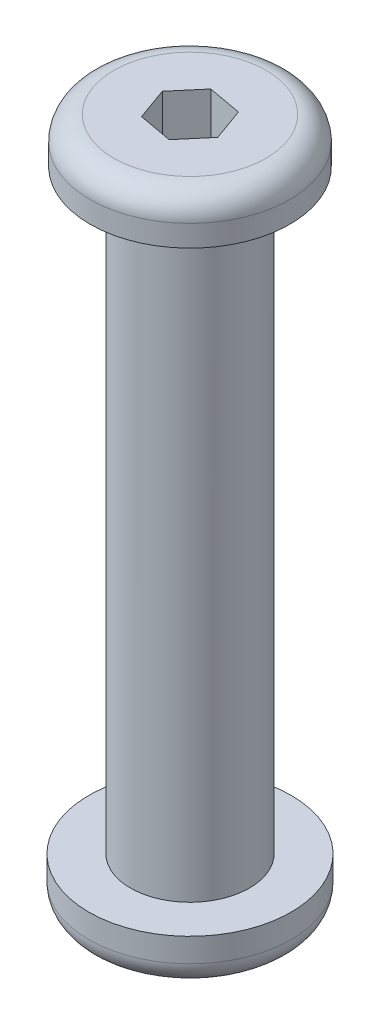
ISO-10303-21;
HEADER;
FILE_DESCRIPTION(('STEP AP214'),'2;1');
FILE_NAME('part.step','',(''),(''),'','','');
FILE_SCHEMA(('AUTOMOTIVE_DESIGN { 1 0 10303 214 1 1 1 1 }'));
ENDSEC;
DATA;
#1=APPLICATION_CONTEXT('core data for automotive mechanical design processes');
#2=APPLICATION_PROTOCOL_DEFINITION('international standard','automotive_design',2000,#1);
#3=PRODUCT_CONTEXT('',#1,'mechanical');
#4=PRODUCT('Part','Part','',(#3));
#5=PRODUCT_RELATED_PRODUCT_CATEGORY('part','',(#4));
#6=PRODUCT_DEFINITION_FORMATION('','',#4);
#7=PRODUCT_DEFINITION_CONTEXT('part definition',#1,'design');
#8=PRODUCT_DEFINITION('design','',#6,#7);
#9=PRODUCT_DEFINITION_SHAPE('','',#8);
#10=(LENGTH_UNIT() NAMED_UNIT(*) SI_UNIT(.MILLI.,.METRE.));
#11=(NAMED_UNIT(*) PLANE_ANGLE_UNIT() SI_UNIT($,.RADIAN.));
#12=(NAMED_UNIT(*) SI_UNIT($,.STERADIAN.) SOLID_ANGLE_UNIT());
#13=UNCERTAINTY_MEASURE_WITH_UNIT(LENGTH_MEASURE(1.E-05),#10,'distance_accuracy_value','');
#14=(GEOMETRIC_REPRESENTATION_CONTEXT(3) GLOBAL_UNCERTAINTY_ASSIGNED_CONTEXT((#13)) GLOBAL_UNIT_ASSIGNED_CONTEXT((#10,
#11,#12)) REPRESENTATION_CONTEXT('',''));
#15=CARTESIAN_POINT('',(0.,0.,0.));
#16=DIRECTION('',(0.,0.,1.));
#17=DIRECTION('',(1.,0.,0.));
#18=AXIS2_PLACEMENT_3D('',#15,#16,#17);
#19=CARTESIAN_POINT('',(0.,25.,0.));
#20=DIRECTION('',(0.,-1.,0.));
#21=DIRECTION('',(0.,0.,-1.));
#22=AXIS2_PLACEMENT_3D('',#19,#20,#21);
#23=CYLINDRICAL_SURFACE('',#22,2.5);
#24=CARTESIAN_POINT('',(0.,25.,0.));
#25=DIRECTION('',(0.,1.,0.));
#26=DIRECTION('',(0.,0.,1.));
#27=AXIS2_PLACEMENT_3D('',#24,#25,#26);
#28=CIRCLE('',#27,2.5);
#29=CARTESIAN_POINT('',(0.,25.,2.5));
#30=VERTEX_POINT('',#29);
#31=EDGE_CURVE('E236',#30,#30,#28,.T.);
#32=ORIENTED_EDGE('',*,*,#31,.F.);
#33=EDGE_LOOP('',(#32));
#34=FACE_BOUND('',#33,.T.);
#35=CARTESIAN_POINT('',(0.,0.,0.));
#36=DIRECTION('',(0.,-1.,0.));
#37=DIRECTION('',(0.,0.,-1.));
#38=AXIS2_PLACEMENT_3D('',#35,#36,#37);
#39=CIRCLE('',#38,2.5);
#40=CARTESIAN_POINT('',(0.,0.,-2.5));
#41=VERTEX_POINT('',#40);
#42=EDGE_CURVE('E188',#41,#41,#39,.T.);
#43=ORIENTED_EDGE('',*,*,#42,.F.);
#44=EDGE_LOOP('',(#43));
#45=FACE_BOUND('',#44,.T.);
#46=ADVANCED_FACE('F41',(#34,#45),#23,.T.);
#47=CARTESIAN_POINT('',(0.,26.9,0.));
#48=DIRECTION('',(0.,1.,0.));
#49=DIRECTION('',(0.,0.,1.));
#50=AXIS2_PLACEMENT_3D('',#47,#48,#49);
#51=PLANE('',#50);
#52=CARTESIAN_POINT('',(0.,26.9,0.));
#53=DIRECTION('',(0.,1.,0.));
#54=DIRECTION('',(0.,0.,1.));
#55=AXIS2_PLACEMENT_3D('',#52,#53,#54);
#56=CIRCLE('',#55,3.2);
#57=CARTESIAN_POINT('',(0.,26.9,3.2));
#58=VERTEX_POINT('',#57);
#59=EDGE_CURVE('E239',#58,#58,#56,.T.);
#60=ORIENTED_EDGE('',*,*,#59,.T.);
#61=EDGE_LOOP('',(#60));
#62=FACE_BOUND('',#61,.T.);
#63=DIRECTION('',(-0.983890145469255,0.,-0.178774107880554));
#64=VECTOR('',#63,1.);
#65=CARTESIAN_POINT('',(0.933529185275309,26.9,-1.10084358270035));
#66=LINE('',#65,#64);
#67=CARTESIAN_POINT('',(0.933529185275309,26.9,-1.10084358270035));
#68=VERTEX_POINT('',#67);
#69=CARTESIAN_POINT('',(-0.486593915573927,26.9,-1.35888178097279));
#70=VERTEX_POINT('',#69);
#71=EDGE_CURVE('E193',#68,#70,#66,.T.);
#72=ORIENTED_EDGE('',*,*,#71,.F.);
#73=DIRECTION('',(-0.337122153771169,0.,-0.941460914449818));
#74=VECTOR('',#73,1.);
#75=CARTESIAN_POINT('',(1.42012310084924,26.9,0.258038198272432));
#76=LINE('',#75,#74);
#77=CARTESIAN_POINT('',(1.42012310084924,26.9,0.258038198272432));
#78=VERTEX_POINT('',#77);
#79=EDGE_CURVE('E191',#78,#68,#76,.T.);
#80=ORIENTED_EDGE('',*,*,#79,.F.);
#81=DIRECTION('',(0.646767991698087,0.,-0.762686806569265));
#82=VECTOR('',#81,1.);
#83=CARTESIAN_POINT('',(0.486593915573928,26.9,1.35888178097278));
#84=LINE('',#83,#82);
#85=CARTESIAN_POINT('',(0.486593915573928,26.9,1.35888178097278));
#86=VERTEX_POINT('',#85);
#87=EDGE_CURVE('E203',#86,#78,#84,.T.);
#88=ORIENTED_EDGE('',*,*,#87,.F.);
#89=DIRECTION('',(0.983890145469255,0.,0.178774107880553));
#90=VECTOR('',#89,1.);
#91=CARTESIAN_POINT('',(-0.933529185275311,26.9,1.10084358270035));
#92=LINE('',#91,#90);
#93=CARTESIAN_POINT('',(-0.933529185275311,26.9,1.10084358270035));
#94=VERTEX_POINT('',#93);
#95=EDGE_CURVE('E200',#94,#86,#92,.T.);
#96=ORIENTED_EDGE('',*,*,#95,.F.);
#97=DIRECTION('',(0.337122153771169,0.,0.941460914449818));
#98=VECTOR('',#97,1.);
#99=CARTESIAN_POINT('',(-1.42012310084924,26.9,-0.258038198272431));
#100=LINE('',#99,#98);
#101=CARTESIAN_POINT('',(-1.42012310084924,26.9,-0.258038198272431));
#102=VERTEX_POINT('',#101);
#103=EDGE_CURVE('E198',#102,#94,#100,.T.);
#104=ORIENTED_EDGE('',*,*,#103,.F.);
#105=DIRECTION('',(-0.646767991698087,0.,0.762686806569266));
#106=VECTOR('',#105,1.);
#107=CARTESIAN_POINT('',(-0.486593915573927,26.9,-1.35888178097279));
#108=LINE('',#107,#106);
#109=EDGE_CURVE('E196',#70,#102,#108,.T.);
#110=ORIENTED_EDGE('',*,*,#109,.F.);
#111=EDGE_LOOP('',(#72,#80,#88,#96,#104,#110));
#112=FACE_BOUND('',#111,.T.);
#113=ADVANCED_FACE('F258',(#62,#112),#51,.T.);
#114=CARTESIAN_POINT('',(0.,25.,0.));
#115=DIRECTION('',(0.,1.,0.));
#116=DIRECTION('',(0.,0.,1.));
#117=AXIS2_PLACEMENT_3D('',#114,#115,#116);
#118=PLANE('',#117);
#119=ORIENTED_EDGE('',*,*,#31,.T.);
#120=EDGE_LOOP('',(#119));
#121=FACE_BOUND('',#120,.T.);
#122=CARTESIAN_POINT('',(0.,25.,0.));
#123=DIRECTION('',(0.,1.,0.));
#124=DIRECTION('',(0.,0.,1.));
#125=AXIS2_PLACEMENT_3D('',#122,#123,#124);
#126=CIRCLE('',#125,4.2);
#127=CARTESIAN_POINT('',(0.,25.,-4.2));
#128=VERTEX_POINT('',#127);
#129=EDGE_CURVE('E233',#128,#128,#126,.T.);
#130=ORIENTED_EDGE('',*,*,#129,.F.);
#131=EDGE_LOOP('',(#130));
#132=FACE_BOUND('',#131,.T.);
#133=ADVANCED_FACE('F265',(#121,#132),#118,.F.);
#134=CARTESIAN_POINT('',(0.,26.9,0.));
#135=DIRECTION('',(0.,-1.,0.));
#136=DIRECTION('',(0.,0.,-1.));
#137=AXIS2_PLACEMENT_3D('',#134,#135,#136);
#138=CYLINDRICAL_SURFACE('',#137,4.2);
#139=CARTESIAN_POINT('',(0.,25.9,0.));
#140=DIRECTION('',(0.,1.,0.));
#141=DIRECTION('',(0.,0.,1.));
#142=AXIS2_PLACEMENT_3D('',#139,#140,#141);
#143=CIRCLE('',#142,4.2);
#144=CARTESIAN_POINT('',(0.,25.9,-4.2));
#145=VERTEX_POINT('',#144);
#146=EDGE_CURVE('E242',#145,#145,#143,.F.);
#147=CARTESIAN_POINT('',(0.,25.9,-4.2));
#148=CARTESIAN_POINT('',(0.,25.890625,-4.2));
#149=CARTESIAN_POINT('',(0.,25.88125,-4.2));
#150=CARTESIAN_POINT('',(0.,25.8625,-4.2));
#151=CARTESIAN_POINT('',(0.,25.853125,-4.2));
#152=CARTESIAN_POINT('',(0.,25.834375,-4.2));
#153=CARTESIAN_POINT('',(0.,25.825,-4.2));
#154=CARTESIAN_POINT('',(0.,25.80625,-4.2));
#155=CARTESIAN_POINT('',(0.,25.796875,-4.2));
#156=CARTESIAN_POINT('',(0.,25.778125,-4.2));
#157=CARTESIAN_POINT('',(0.,25.76875,-4.2));
#158=CARTESIAN_POINT('',(0.,25.75,-4.2));
#159=CARTESIAN_POINT('',(0.,25.740625,-4.2));
#160=CARTESIAN_POINT('',(0.,25.721875,-4.2));
#161=CARTESIAN_POINT('',(0.,25.7125,-4.2));
#162=CARTESIAN_POINT('',(0.,25.69375,-4.2));
#163=CARTESIAN_POINT('',(0.,25.684375,-4.2));
#164=CARTESIAN_POINT('',(0.,25.665625,-4.2));
#165=CARTESIAN_POINT('',(0.,25.65625,-4.2));
#166=CARTESIAN_POINT('',(0.,25.6375,-4.2));
#167=CARTESIAN_POINT('',(0.,25.628125,-4.2));
#168=CARTESIAN_POINT('',(0.,25.609375,-4.2));
#169=CARTESIAN_POINT('',(0.,25.6,-4.2));
#170=CARTESIAN_POINT('',(0.,25.58125,-4.2));
#171=CARTESIAN_POINT('',(0.,25.571875,-4.2));
#172=CARTESIAN_POINT('',(0.,25.553125,-4.2));
#173=CARTESIAN_POINT('',(0.,25.54375,-4.2));
#174=CARTESIAN_POINT('',(0.,25.525,-4.2));
#175=CARTESIAN_POINT('',(0.,25.515625,-4.2));
#176=CARTESIAN_POINT('',(0.,25.496875,-4.2));
#177=CARTESIAN_POINT('',(0.,25.4875,-4.2));
#178=CARTESIAN_POINT('',(0.,25.46875,-4.2));
#179=CARTESIAN_POINT('',(0.,25.459375,-4.2));
#180=CARTESIAN_POINT('',(0.,25.440625,-4.2));
#181=CARTESIAN_POINT('',(0.,25.43125,-4.2));
#182=CARTESIAN_POINT('',(0.,25.4125,-4.2));
#183=CARTESIAN_POINT('',(0.,25.403125,-4.2));
#184=CARTESIAN_POINT('',(0.,25.384375,-4.2));
#185=CARTESIAN_POINT('',(0.,25.375,-4.2));
#186=CARTESIAN_POINT('',(0.,25.35625,-4.2));
#187=CARTESIAN_POINT('',(0.,25.346875,-4.2));
#188=CARTESIAN_POINT('',(0.,25.328125,-4.2));
#189=CARTESIAN_POINT('',(0.,25.31875,-4.2));
#190=CARTESIAN_POINT('',(0.,25.3,-4.2));
#191=CARTESIAN_POINT('',(0.,25.290625,-4.2));
#192=CARTESIAN_POINT('',(0.,25.271875,-4.2));
#193=CARTESIAN_POINT('',(0.,25.2625,-4.2));
#194=CARTESIAN_POINT('',(0.,25.24375,-4.2));
#195=CARTESIAN_POINT('',(0.,25.234375,-4.2));
#196=CARTESIAN_POINT('',(0.,25.215625,-4.2));
#197=CARTESIAN_POINT('',(0.,25.20625,-4.2));
#198=CARTESIAN_POINT('',(0.,25.1875,-4.2));
#199=CARTESIAN_POINT('',(0.,25.178125,-4.2));
#200=CARTESIAN_POINT('',(0.,25.159375,-4.2));
#201=CARTESIAN_POINT('',(0.,25.15,-4.2));
#202=CARTESIAN_POINT('',(0.,25.13125,-4.2));
#203=CARTESIAN_POINT('',(0.,25.121875,-4.2));
#204=CARTESIAN_POINT('',(0.,25.103125,-4.2));
#205=CARTESIAN_POINT('',(0.,25.09375,-4.2));
#206=CARTESIAN_POINT('',(0.,25.075,-4.2));
#207=CARTESIAN_POINT('',(0.,25.065625,-4.2));
#208=CARTESIAN_POINT('',(0.,25.046875,-4.2));
#209=CARTESIAN_POINT('',(0.,25.0375,-4.2));
#210=CARTESIAN_POINT('',(0.,25.01875,-4.2));
#211=CARTESIAN_POINT('',(0.,25.009375,-4.2));
#212=CARTESIAN_POINT('',(0.,25.,-4.2));
#213=B_SPLINE_CURVE_WITH_KNOTS('',3,(#147,#148,#149,#150,#151,#152,#153,#154,#155,#156,#157,
#158,#159,#160,#161,#162,#163,#164,#165,#166,#167,#168,#169,#170,#171,#172,#173,#174,#175,#176,
#177,#178,#179,#180,#181,#182,#183,#184,#185,#186,#187,#188,#189,#190,#191,#192,#193,#194,#195,
#196,#197,#198,#199,#200,#201,#202,#203,#204,#205,#206,#207,#208,#209,#210,#211,#212),
.UNSPECIFIED.,.F.,.F.,(4,2,2,2,2,2,2,2,2,2,2,2,2,2,2,2,2,2,2,2,2,2,2,2,2,2,2,2,2,2,2,2,4),(0.,
0.0281249999999969,0.0562499999999973,0.0843749999999976,0.112499999999998,0.140624999999998,
0.168749999999999,0.196874999999999,0.225,0.253124999999996,0.281249999999997,0.309374999999997,
0.337499999999998,0.365624999999998,0.393749999999998,0.421874999999999,0.449999999999999,
0.478124999999996,0.506249999999996,0.534374999999997,0.562499999999997,0.590624999999997,
0.618749999999998,0.646874999999998,0.674999999999998,0.703124999999995,0.731249999999996,
0.759374999999996,0.787499999999997,0.815624999999997,0.843749999999997,0.871874999999998,
0.899999999999998),.UNSPECIFIED.);
#214=EDGE_CURVE('BSEAM279',#145,#128,#213,.T.);
#215=ORIENTED_EDGE('',*,*,#146,.T.);
#216=ORIENTED_EDGE('',*,*,#129,.T.);
#217=ORIENTED_EDGE('',*,*,#214,.T.);
#218=ORIENTED_EDGE('',*,*,#214,.F.);
#219=EDGE_LOOP('',(#215,#217,#216,#218));
#220=FACE_BOUND('',#219,.T.);
#221=ADVANCED_FACE('F279',(#220),#138,.T.);
#222=CARTESIAN_POINT('',(1.42012310084924,26.9,0.258038198272432));
#223=DIRECTION('',(-0.941460914449818,0.,0.337122153771169));
#224=DIRECTION('',(0.337122153771169,0.,0.941460914449819));
#225=AXIS2_PLACEMENT_3D('',#222,#223,#224);
#226=PLANE('',#225);
#227=DIRECTION('',(-0.337122153771169,0.,-0.941460914449818));
#228=VECTOR('',#227,1.);
#229=CARTESIAN_POINT('',(1.42012310084924,25.,0.258038198272432));
#230=LINE('',#229,#228);
#231=CARTESIAN_POINT('',(1.42012310084924,25.,0.258038198272432));
#232=VERTEX_POINT('',#231);
#233=CARTESIAN_POINT('',(0.933529185275309,25.,-1.10084358270035));
#234=VERTEX_POINT('',#233);
#235=EDGE_CURVE('E64',#232,#234,#230,.T.);
#236=ORIENTED_EDGE('',*,*,#235,.F.);
#237=DIRECTION('',(0.,-1.,0.));
#238=VECTOR('',#237,1.);
#239=CARTESIAN_POINT('',(1.42012310084924,26.9,0.258038198272432));
#240=LINE('',#239,#238);
#241=EDGE_CURVE('E205',#78,#232,#240,.T.);
#242=ORIENTED_EDGE('',*,*,#241,.F.);
#243=ORIENTED_EDGE('',*,*,#79,.T.);
#244=DIRECTION('',(0.,-1.,0.));
#245=VECTOR('',#244,1.);
#246=CARTESIAN_POINT('',(0.933529185275309,26.9,-1.10084358270035));
#247=LINE('',#246,#245);
#248=EDGE_CURVE('E230',#68,#234,#247,.T.);
#249=ORIENTED_EDGE('',*,*,#248,.T.);
#250=EDGE_LOOP('',(#236,#242,#243,#249));
#251=FACE_BOUND('',#250,.T.);
#252=ADVANCED_FACE('F282',(#251),#226,.T.);
#253=CARTESIAN_POINT('',(0.933529185275309,26.9,-1.10084358270035));
#254=DIRECTION('',(-0.178774107880554,0.,0.983890145469255));
#255=DIRECTION('',(0.983890145469255,0.,0.178774107880554));
#256=AXIS2_PLACEMENT_3D('',#253,#254,#255);
#257=PLANE('',#256);
#258=DIRECTION('',(-0.983890145469255,0.,-0.178774107880554));
#259=VECTOR('',#258,1.);
#260=CARTESIAN_POINT('',(0.933529185275309,25.,-1.10084358270035));
#261=LINE('',#260,#259);
#262=CARTESIAN_POINT('',(-0.486593915573927,25.,-1.35888178097279));
#263=VERTEX_POINT('',#262);
#264=EDGE_CURVE('E207',#234,#263,#261,.T.);
#265=ORIENTED_EDGE('',*,*,#264,.F.);
#266=ORIENTED_EDGE('',*,*,#248,.F.);
#267=ORIENTED_EDGE('',*,*,#71,.T.);
#268=DIRECTION('',(0.,-1.,0.));
#269=VECTOR('',#268,1.);
#270=CARTESIAN_POINT('',(-0.486593915573927,26.9,-1.35888178097279));
#271=LINE('',#270,#269);
#272=EDGE_CURVE('E227',#70,#263,#271,.T.);
#273=ORIENTED_EDGE('',*,*,#272,.T.);
#274=EDGE_LOOP('',(#265,#266,#267,#273));
#275=FACE_BOUND('',#274,.T.);
#276=ADVANCED_FACE('F288',(#275),#257,.T.);
#277=CARTESIAN_POINT('',(-0.486593915573927,26.9,-1.35888178097279));
#278=DIRECTION('',(0.762686806569265,0.,0.646767991698086));
#279=DIRECTION('',(0.646767991698086,0.,-0.762686806569266));
#280=AXIS2_PLACEMENT_3D('',#277,#278,#279);
#281=PLANE('',#280);
#282=DIRECTION('',(-0.646767991698087,0.,0.762686806569266));
#283=VECTOR('',#282,1.);
#284=CARTESIAN_POINT('',(-0.486593915573927,25.,-1.35888178097279));
#285=LINE('',#284,#283);
#286=CARTESIAN_POINT('',(-1.42012310084924,25.,-0.258038198272431));
#287=VERTEX_POINT('',#286);
#288=EDGE_CURVE('E209',#263,#287,#285,.T.);
#289=ORIENTED_EDGE('',*,*,#288,.F.);
#290=ORIENTED_EDGE('',*,*,#272,.F.);
#291=ORIENTED_EDGE('',*,*,#109,.T.);
#292=DIRECTION('',(0.,-1.,0.));
#293=VECTOR('',#292,1.);
#294=CARTESIAN_POINT('',(-1.42012310084924,26.9,-0.258038198272431));
#295=LINE('',#294,#293);
#296=EDGE_CURVE('E224',#102,#287,#295,.T.);
#297=ORIENTED_EDGE('',*,*,#296,.T.);
#298=EDGE_LOOP('',(#289,#290,#291,#297));
#299=FACE_BOUND('',#298,.T.);
#300=ADVANCED_FACE('F292',(#299),#281,.T.);
#301=CARTESIAN_POINT('',(-1.42012310084924,26.9,-0.258038198272431));
#302=DIRECTION('',(0.941460914449818,0.,-0.337122153771169));
#303=DIRECTION('',(-0.337122153771169,0.,-0.941460914449818));
#304=AXIS2_PLACEMENT_3D('',#301,#302,#303);
#305=PLANE('',#304);
#306=DIRECTION('',(0.337122153771169,0.,0.941460914449818));
#307=VECTOR('',#306,1.);
#308=CARTESIAN_POINT('',(-1.42012310084924,25.,-0.258038198272431));
#309=LINE('',#308,#307);
#310=CARTESIAN_POINT('',(-0.933529185275311,25.,1.10084358270035));
#311=VERTEX_POINT('',#310);
#312=EDGE_CURVE('E211',#287,#311,#309,.T.);
#313=ORIENTED_EDGE('',*,*,#312,.F.);
#314=ORIENTED_EDGE('',*,*,#296,.F.);
#315=ORIENTED_EDGE('',*,*,#103,.T.);
#316=DIRECTION('',(0.,-1.,0.));
#317=VECTOR('',#316,1.);
#318=CARTESIAN_POINT('',(-0.933529185275311,26.9,1.10084358270035));
#319=LINE('',#318,#317);
#320=EDGE_CURVE('E221',#94,#311,#319,.T.);
#321=ORIENTED_EDGE('',*,*,#320,.T.);
#322=EDGE_LOOP('',(#313,#314,#315,#321));
#323=FACE_BOUND('',#322,.T.);
#324=ADVANCED_FACE('F296',(#323),#305,.T.);
#325=CARTESIAN_POINT('',(-0.933529185275311,26.9,1.10084358270035));
#326=DIRECTION('',(0.178774107880553,0.,-0.983890145469255));
#327=DIRECTION('',(-0.983890145469255,0.,-0.178774107880553));
#328=AXIS2_PLACEMENT_3D('',#325,#326,#327);
#329=PLANE('',#328);
#330=DIRECTION('',(0.983890145469255,0.,0.178774107880553));
#331=VECTOR('',#330,1.);
#332=CARTESIAN_POINT('',(-0.933529185275311,25.,1.10084358270035));
#333=LINE('',#332,#331);
#334=CARTESIAN_POINT('',(0.486593915573928,25.,1.35888178097278));
#335=VERTEX_POINT('',#334);
#336=EDGE_CURVE('E213',#311,#335,#333,.T.);
#337=ORIENTED_EDGE('',*,*,#336,.F.);
#338=ORIENTED_EDGE('',*,*,#320,.F.);
#339=ORIENTED_EDGE('',*,*,#95,.T.);
#340=DIRECTION('',(0.,-1.,0.));
#341=VECTOR('',#340,1.);
#342=CARTESIAN_POINT('',(0.486593915573928,26.9,1.35888178097278));
#343=LINE('',#342,#341);
#344=EDGE_CURVE('E218',#86,#335,#343,.T.);
#345=ORIENTED_EDGE('',*,*,#344,.T.);
#346=EDGE_LOOP('',(#337,#338,#339,#345));
#347=FACE_BOUND('',#346,.T.);
#348=ADVANCED_FACE('F300',(#347),#329,.T.);
#349=CARTESIAN_POINT('',(0.486593915573928,26.9,1.35888178097278));
#350=DIRECTION('',(-0.762686806569265,0.,-0.646767991698086));
#351=DIRECTION('',(-0.646767991698087,0.,0.762686806569265));
#352=AXIS2_PLACEMENT_3D('',#349,#350,#351);
#353=PLANE('',#352);
#354=DIRECTION('',(0.646767991698087,0.,-0.762686806569265));
#355=VECTOR('',#354,1.);
#356=CARTESIAN_POINT('',(0.486593915573928,25.,1.35888178097278));
#357=LINE('',#356,#355);
#358=EDGE_CURVE('E194',#335,#232,#357,.T.);
#359=ORIENTED_EDGE('',*,*,#358,.F.);
#360=ORIENTED_EDGE('',*,*,#344,.F.);
#361=ORIENTED_EDGE('',*,*,#87,.T.);
#362=ORIENTED_EDGE('',*,*,#241,.T.);
#363=EDGE_LOOP('',(#359,#360,#361,#362));
#364=FACE_BOUND('',#363,.T.);
#365=ADVANCED_FACE('F278',(#364),#353,.T.);
#366=CARTESIAN_POINT('',(0.,25.,0.));
#367=DIRECTION('',(0.,1.,0.));
#368=DIRECTION('',(0.,0.,1.));
#369=AXIS2_PLACEMENT_3D('',#366,#367,#368);
#370=PLANE('',#369);
#371=ORIENTED_EDGE('',*,*,#235,.T.);
#372=ORIENTED_EDGE('',*,*,#264,.T.);
#373=ORIENTED_EDGE('',*,*,#288,.T.);
#374=ORIENTED_EDGE('',*,*,#312,.T.);
#375=ORIENTED_EDGE('',*,*,#336,.T.);
#376=ORIENTED_EDGE('',*,*,#358,.T.);
#377=EDGE_LOOP('',(#371,#372,#373,#374,#375,#376));
#378=FACE_BOUND('',#377,.T.);
#379=ADVANCED_FACE('F275',(#378),#370,.T.);
#380=CARTESIAN_POINT('',(0.,-2.,0.));
#381=DIRECTION('',(0.,-1.,0.));
#382=DIRECTION('',(0.,0.,-1.));
#383=AXIS2_PLACEMENT_3D('',#380,#381,#382);
#384=PLANE('',#383);
#385=CARTESIAN_POINT('',(0.,-2.,0.));
#386=DIRECTION('',(0.,-1.,0.));
#387=DIRECTION('',(0.,0.,-1.));
#388=AXIS2_PLACEMENT_3D('',#385,#386,#387);
#389=CIRCLE('',#388,3.25);
#390=CARTESIAN_POINT('',(0.,-2.,-3.25));
#391=VERTEX_POINT('',#390);
#392=EDGE_CURVE('E49',#391,#391,#389,.T.);
#393=ORIENTED_EDGE('',*,*,#392,.T.);
#394=EDGE_LOOP('',(#393));
#395=FACE_BOUND('',#394,.T.);
#396=DIRECTION('',(-0.995901214221312,0.,0.0904476175060285));
#397=VECTOR('',#396,1.);
#398=CARTESIAN_POINT('',(0.831789314528723,-2.,1.17960157238331));
#399=LINE('',#398,#397);
#400=CARTESIAN_POINT('',(0.831789314528723,-2.,1.17960157238331));
#401=VERTEX_POINT('',#400);
#402=CARTESIAN_POINT('',(-0.605670270763652,-2.,1.31015146316997));
#403=VERTEX_POINT('',#402);
#404=EDGE_CURVE('E139',#401,#403,#399,.T.);
#405=ORIENTED_EDGE('',*,*,#404,.F.);
#406=DIRECTION('',(-0.419620672638657,0.,0.907699559928439));
#407=VECTOR('',#406,1.);
#408=CARTESIAN_POINT('',(1.43745958529237,-2.,-0.130549890786665));
#409=LINE('',#408,#407);
#410=CARTESIAN_POINT('',(1.43745958529237,-2.,-0.130549890786665));
#411=VERTEX_POINT('',#410);
#412=EDGE_CURVE('E131',#411,#401,#409,.T.);
#413=ORIENTED_EDGE('',*,*,#412,.F.);
#414=DIRECTION('',(0.576280541582655,0.,0.81725194242241));
#415=VECTOR('',#414,1.);
#416=CARTESIAN_POINT('',(0.605670270763651,-2.,-1.31015146316997));
#417=LINE('',#416,#415);
#418=CARTESIAN_POINT('',(0.605670270763652,-2.,-1.31015146316997));
#419=VERTEX_POINT('',#418);
#420=EDGE_CURVE('E162',#419,#411,#417,.T.);
#421=ORIENTED_EDGE('',*,*,#420,.F.);
#422=DIRECTION('',(0.995901214221312,0.,-0.090447617506028));
#423=VECTOR('',#422,1.);
#424=CARTESIAN_POINT('',(-0.831789314528721,-2.,-1.17960157238331));
#425=LINE('',#424,#423);
#426=CARTESIAN_POINT('',(-0.831789314528721,-2.,-1.17960157238331));
#427=VERTEX_POINT('',#426);
#428=EDGE_CURVE('E159',#427,#419,#425,.T.);
#429=ORIENTED_EDGE('',*,*,#428,.F.);
#430=DIRECTION('',(0.419620672638657,0.,-0.907699559928439));
#431=VECTOR('',#430,1.);
#432=CARTESIAN_POINT('',(-1.43745958529237,-2.,0.130549890786665));
#433=LINE('',#432,#431);
#434=CARTESIAN_POINT('',(-1.43745958529237,-2.,0.130549890786665));
#435=VERTEX_POINT('',#434);
#436=EDGE_CURVE('E155',#435,#427,#433,.T.);
#437=ORIENTED_EDGE('',*,*,#436,.F.);
#438=DIRECTION('',(-0.576280541582654,0.,-0.81725194242241));
#439=VECTOR('',#438,1.);
#440=CARTESIAN_POINT('',(-0.605670270763652,-2.,1.31015146316997));
#441=LINE('',#440,#439);
#442=EDGE_CURVE('E153',#403,#435,#441,.T.);
#443=ORIENTED_EDGE('',*,*,#442,.F.);
#444=EDGE_LOOP('',(#405,#413,#421,#429,#437,#443));
#445=FACE_BOUND('',#444,.T.);
#446=ADVANCED_FACE('F151',(#395,#445),#384,.T.);
#447=CARTESIAN_POINT('',(0.,0.,0.));
#448=DIRECTION('',(0.,-1.,0.));
#449=DIRECTION('',(0.,0.,-1.));
#450=AXIS2_PLACEMENT_3D('',#447,#448,#449);
#451=PLANE('',#450);
#452=ORIENTED_EDGE('',*,*,#42,.T.);
#453=EDGE_LOOP('',(#452));
#454=FACE_BOUND('',#453,.T.);
#455=CARTESIAN_POINT('',(0.,0.,0.));
#456=DIRECTION('',(0.,-1.,0.));
#457=DIRECTION('',(0.,0.,-1.));
#458=AXIS2_PLACEMENT_3D('',#455,#456,#457);
#459=CIRCLE('',#458,4.25);
#460=CARTESIAN_POINT('',(0.,0.,-4.25));
#461=VERTEX_POINT('',#460);
#462=EDGE_CURVE('E147',#461,#461,#459,.T.);
#463=ORIENTED_EDGE('',*,*,#462,.F.);
#464=EDGE_LOOP('',(#463));
#465=FACE_BOUND('',#464,.T.);
#466=ADVANCED_FACE('F311',(#454,#465),#451,.F.);
#467=CARTESIAN_POINT('',(0.,-2.,0.));
#468=DIRECTION('',(0.,1.,0.));
#469=DIRECTION('',(0.,0.,1.));
#470=AXIS2_PLACEMENT_3D('',#467,#468,#469);
#471=CYLINDRICAL_SURFACE('',#470,4.25);
#472=CARTESIAN_POINT('',(0.,-1.,0.));
#473=DIRECTION('',(0.,-1.,0.));
#474=DIRECTION('',(0.,0.,-1.));
#475=AXIS2_PLACEMENT_3D('',#472,#473,#474);
#476=CIRCLE('',#475,4.25);
#477=CARTESIAN_POINT('',(0.,-1.,-4.25));
#478=VERTEX_POINT('',#477);
#479=EDGE_CURVE('E11',#478,#478,#476,.F.);
#480=ORIENTED_EDGE('',*,*,#479,.T.);
#481=EDGE_LOOP('',(#480));
#482=FACE_BOUND('',#481,.T.);
#483=ORIENTED_EDGE('',*,*,#462,.T.);
#484=EDGE_LOOP('',(#483));
#485=FACE_BOUND('',#484,.T.);
#486=ADVANCED_FACE('F308',(#482,#485),#471,.T.);
#487=CARTESIAN_POINT('',(1.43745958529237,-2.,-0.130549890786665));
#488=DIRECTION('',(-0.907699559928439,0.,-0.419620672638657));
#489=DIRECTION('',(-0.419620672638657,0.,0.907699559928439));
#490=AXIS2_PLACEMENT_3D('',#487,#488,#489);
#491=PLANE('',#490);
#492=DIRECTION('',(-0.419620672638657,0.,0.907699559928439));
#493=VECTOR('',#492,1.);
#494=CARTESIAN_POINT('',(1.43745958529237,0.,-0.130549890786665));
#495=LINE('',#494,#493);
#496=CARTESIAN_POINT('',(1.43745958529237,0.,-0.130549890786665));
#497=VERTEX_POINT('',#496);
#498=CARTESIAN_POINT('',(0.831789314528723,0.,1.17960157238331));
#499=VERTEX_POINT('',#498);
#500=EDGE_CURVE('E164',#497,#499,#495,.T.);
#501=ORIENTED_EDGE('',*,*,#500,.F.);
#502=DIRECTION('',(0.,1.,0.));
#503=VECTOR('',#502,1.);
#504=CARTESIAN_POINT('',(1.43745958529237,-2.,-0.130549890786665));
#505=LINE('',#504,#503);
#506=EDGE_CURVE('E56',#411,#497,#505,.T.);
#507=ORIENTED_EDGE('',*,*,#506,.F.);
#508=ORIENTED_EDGE('',*,*,#412,.T.);
#509=DIRECTION('',(0.,1.,0.));
#510=VECTOR('',#509,1.);
#511=CARTESIAN_POINT('',(0.831789314528723,-2.,1.17960157238331));
#512=LINE('',#511,#510);
#513=EDGE_CURVE('E134',#401,#499,#512,.T.);
#514=ORIENTED_EDGE('',*,*,#513,.T.);
#515=EDGE_LOOP('',(#501,#507,#508,#514));
#516=FACE_BOUND('',#515,.T.);
#517=ADVANCED_FACE('F133',(#516),#491,.T.);
#518=CARTESIAN_POINT('',(0.831789314528723,-2.,1.17960157238331));
#519=DIRECTION('',(-0.0904476175060285,0.,-0.995901214221312));
#520=DIRECTION('',(-0.995901214221312,0.,0.0904476175060285));
#521=AXIS2_PLACEMENT_3D('',#518,#519,#520);
#522=PLANE('',#521);
#523=DIRECTION('',(-0.995901214221312,0.,0.0904476175060285));
#524=VECTOR('',#523,1.);
#525=CARTESIAN_POINT('',(0.831789314528723,0.,1.17960157238331));
#526=LINE('',#525,#524);
#527=CARTESIAN_POINT('',(-0.605670270763652,0.,1.31015146316997));
#528=VERTEX_POINT('',#527);
#529=EDGE_CURVE('E146',#499,#528,#526,.T.);
#530=ORIENTED_EDGE('',*,*,#529,.F.);
#531=ORIENTED_EDGE('',*,*,#513,.F.);
#532=ORIENTED_EDGE('',*,*,#404,.T.);
#533=DIRECTION('',(0.,1.,0.));
#534=VECTOR('',#533,1.);
#535=CARTESIAN_POINT('',(-0.605670270763652,-2.,1.31015146316997));
#536=LINE('',#535,#534);
#537=EDGE_CURVE('E148',#403,#528,#536,.T.);
#538=ORIENTED_EDGE('',*,*,#537,.T.);
#539=EDGE_LOOP('',(#530,#531,#532,#538));
#540=FACE_BOUND('',#539,.T.);
#541=ADVANCED_FACE('F143',(#540),#522,.T.);
#542=CARTESIAN_POINT('',(-0.605670270763652,-2.,1.31015146316997));
#543=DIRECTION('',(0.81725194242241,0.,-0.576280541582654));
#544=DIRECTION('',(-0.576280541582654,0.,-0.81725194242241));
#545=AXIS2_PLACEMENT_3D('',#542,#543,#544);
#546=PLANE('',#545);
#547=DIRECTION('',(-0.576280541582654,0.,-0.81725194242241));
#548=VECTOR('',#547,1.);
#549=CARTESIAN_POINT('',(-0.605670270763652,0.,1.31015146316997));
#550=LINE('',#549,#548);
#551=CARTESIAN_POINT('',(-1.43745958529237,0.,0.130549890786665));
#552=VERTEX_POINT('',#551);
#553=EDGE_CURVE('E167',#528,#552,#550,.T.);
#554=ORIENTED_EDGE('',*,*,#553,.F.);
#555=ORIENTED_EDGE('',*,*,#537,.F.);
#556=ORIENTED_EDGE('',*,*,#442,.T.);
#557=DIRECTION('',(0.,1.,0.));
#558=VECTOR('',#557,1.);
#559=CARTESIAN_POINT('',(-1.43745958529237,-2.,0.130549890786665));
#560=LINE('',#559,#558);
#561=EDGE_CURVE('E183',#435,#552,#560,.T.);
#562=ORIENTED_EDGE('',*,*,#561,.T.);
#563=EDGE_LOOP('',(#554,#555,#556,#562));
#564=FACE_BOUND('',#563,.T.);
#565=ADVANCED_FACE('F322',(#564),#546,.T.);
#566=CARTESIAN_POINT('',(-1.43745958529237,-2.,0.130549890786665));
#567=DIRECTION('',(0.907699559928438,0.,0.419620672638657));
#568=DIRECTION('',(0.419620672638657,0.,-0.907699559928439));
#569=AXIS2_PLACEMENT_3D('',#566,#567,#568);
#570=PLANE('',#569);
#571=DIRECTION('',(0.419620672638657,0.,-0.907699559928439));
#572=VECTOR('',#571,1.);
#573=CARTESIAN_POINT('',(-1.43745958529237,0.,0.130549890786665));
#574=LINE('',#573,#572);
#575=CARTESIAN_POINT('',(-0.831789314528721,0.,-1.17960157238331));
#576=VERTEX_POINT('',#575);
#577=EDGE_CURVE('E170',#552,#576,#574,.T.);
#578=ORIENTED_EDGE('',*,*,#577,.F.);
#579=ORIENTED_EDGE('',*,*,#561,.F.);
#580=ORIENTED_EDGE('',*,*,#436,.T.);
#581=DIRECTION('',(0.,1.,0.));
#582=VECTOR('',#581,1.);
#583=CARTESIAN_POINT('',(-0.831789314528721,-2.,-1.17960157238331));
#584=LINE('',#583,#582);
#585=EDGE_CURVE('E181',#427,#576,#584,.T.);
#586=ORIENTED_EDGE('',*,*,#585,.T.);
#587=EDGE_LOOP('',(#578,#579,#580,#586));
#588=FACE_BOUND('',#587,.T.);
#589=ADVANCED_FACE('F325',(#588),#570,.T.);
#590=CARTESIAN_POINT('',(-0.831789314528721,-2.,-1.17960157238331));
#591=DIRECTION('',(0.090447617506028,0.,0.995901214221312));
#592=DIRECTION('',(0.995901214221312,0.,-0.090447617506028));
#593=AXIS2_PLACEMENT_3D('',#590,#591,#592);
#594=PLANE('',#593);
#595=DIRECTION('',(0.995901214221312,0.,-0.090447617506028));
#596=VECTOR('',#595,1.);
#597=CARTESIAN_POINT('',(-0.831789314528721,0.,-1.17960157238331));
#598=LINE('',#597,#596);
#599=CARTESIAN_POINT('',(0.605670270763651,0.,-1.31015146316997));
#600=VERTEX_POINT('',#599);
#601=EDGE_CURVE('E173',#576,#600,#598,.T.);
#602=ORIENTED_EDGE('',*,*,#601,.F.);
#603=ORIENTED_EDGE('',*,*,#585,.F.);
#604=ORIENTED_EDGE('',*,*,#428,.T.);
#605=DIRECTION('',(0.,1.,0.));
#606=VECTOR('',#605,1.);
#607=CARTESIAN_POINT('',(0.605670270763651,-2.,-1.31015146316997));
#608=LINE('',#607,#606);
#609=EDGE_CURVE('E179',#419,#600,#608,.T.);
#610=ORIENTED_EDGE('',*,*,#609,.T.);
#611=EDGE_LOOP('',(#602,#603,#604,#610));
#612=FACE_BOUND('',#611,.T.);
#613=ADVANCED_FACE('F329',(#612),#594,.T.);
#614=CARTESIAN_POINT('',(0.605670270763651,-2.,-1.31015146316997));
#615=DIRECTION('',(-0.81725194242241,0.,0.576280541582655));
#616=DIRECTION('',(0.576280541582655,0.,0.81725194242241));
#617=AXIS2_PLACEMENT_3D('',#614,#615,#616);
#618=PLANE('',#617);
#619=DIRECTION('',(0.576280541582655,0.,0.81725194242241));
#620=VECTOR('',#619,1.);
#621=CARTESIAN_POINT('',(0.605670270763651,0.,-1.31015146316997));
#622=LINE('',#621,#620);
#623=EDGE_CURVE('E140',#600,#497,#622,.T.);
#624=ORIENTED_EDGE('',*,*,#623,.F.);
#625=ORIENTED_EDGE('',*,*,#609,.F.);
#626=ORIENTED_EDGE('',*,*,#420,.T.);
#627=ORIENTED_EDGE('',*,*,#506,.T.);
#628=EDGE_LOOP('',(#624,#625,#626,#627));
#629=FACE_BOUND('',#628,.T.);
#630=ADVANCED_FACE('F273',(#629),#618,.T.);
#631=CARTESIAN_POINT('',(0.,0.,0.));
#632=DIRECTION('',(0.,1.,0.));
#633=DIRECTION('',(0.,0.,1.));
#634=AXIS2_PLACEMENT_3D('',#631,#632,#633);
#635=PLANE('',#634);
#636=ORIENTED_EDGE('',*,*,#623,.T.);
#637=ORIENTED_EDGE('',*,*,#500,.T.);
#638=ORIENTED_EDGE('',*,*,#529,.T.);
#639=ORIENTED_EDGE('',*,*,#553,.T.);
#640=ORIENTED_EDGE('',*,*,#577,.T.);
#641=ORIENTED_EDGE('',*,*,#601,.T.);
#642=EDGE_LOOP('',(#636,#637,#638,#639,#640,#641));
#643=FACE_BOUND('',#642,.T.);
#644=ADVANCED_FACE('F254',(#643),#635,.F.);
#645=CARTESIAN_POINT('',(0.,25.9,0.));
#646=DIRECTION('',(0.,1.,0.));
#647=DIRECTION('',(0.,0.,1.));
#648=AXIS2_PLACEMENT_3D('',#645,#646,#647);
#649=TOROIDAL_SURFACE('',#648,3.2,1.);
#650=ORIENTED_EDGE('',*,*,#146,.F.);
#651=EDGE_LOOP('',(#650));
#652=FACE_BOUND('',#651,.T.);
#653=ORIENTED_EDGE('',*,*,#59,.F.);
#654=EDGE_LOOP('',(#653));
#655=FACE_BOUND('',#654,.T.);
#656=ADVANCED_FACE('F249',(#652,#655),#649,.T.);
#657=CARTESIAN_POINT('',(0.,-1.,0.));
#658=DIRECTION('',(0.,-1.,0.));
#659=DIRECTION('',(0.,0.,-1.));
#660=AXIS2_PLACEMENT_3D('',#657,#658,#659);
#661=TOROIDAL_SURFACE('',#660,3.25,1.);
#662=ORIENTED_EDGE('',*,*,#479,.F.);
#663=EDGE_LOOP('',(#662));
#664=FACE_BOUND('',#663,.T.);
#665=ORIENTED_EDGE('',*,*,#392,.F.);
#666=EDGE_LOOP('',(#665));
#667=FACE_BOUND('',#666,.T.);
#668=ADVANCED_FACE('F43',(#664,#667),#661,.T.);
#669=CLOSED_SHELL('',(#46,#113,#133,#221,#252,#276,#300,#324,#348,#365,#379,#446,#466,#486,#517,
#541,#565,#589,#613,#630,#644,#656,#668));
#670=MANIFOLD_SOLID_BREP('B2',#669);
#671=ADVANCED_BREP_SHAPE_REPRESENTATION('',(#18,#670),#14);
#672=SHAPE_DEFINITION_REPRESENTATION(#9,#671);
ENDSEC;
END-ISO-10303-21;
